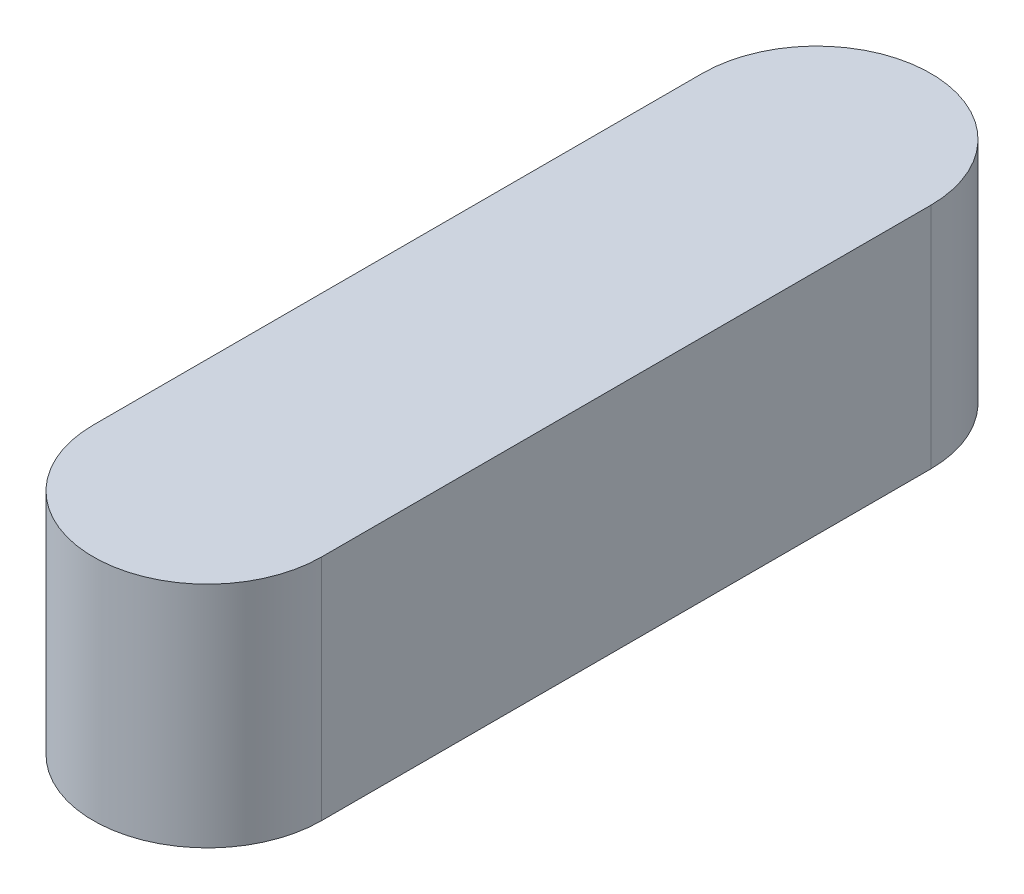
ISO-10303-21;
HEADER;
FILE_DESCRIPTION(('STEP AP214'),'2;1');
FILE_NAME('part.step','',(''),(''),'','','');
FILE_SCHEMA(('AUTOMOTIVE_DESIGN { 1 0 10303 214 1 1 1 1 }'));
ENDSEC;
DATA;
#1=APPLICATION_CONTEXT('core data for automotive mechanical design processes');
#2=APPLICATION_PROTOCOL_DEFINITION('international standard','automotive_design',2000,#1);
#3=PRODUCT_CONTEXT('',#1,'mechanical');
#4=PRODUCT('Part','Part','',(#3));
#5=PRODUCT_RELATED_PRODUCT_CATEGORY('part','',(#4));
#6=PRODUCT_DEFINITION_FORMATION('','',#4);
#7=PRODUCT_DEFINITION_CONTEXT('part definition',#1,'design');
#8=PRODUCT_DEFINITION('design','',#6,#7);
#9=PRODUCT_DEFINITION_SHAPE('','',#8);
#10=(LENGTH_UNIT() NAMED_UNIT(*) SI_UNIT(.MILLI.,.METRE.));
#11=(NAMED_UNIT(*) PLANE_ANGLE_UNIT() SI_UNIT($,.RADIAN.));
#12=(NAMED_UNIT(*) SI_UNIT($,.STERADIAN.) SOLID_ANGLE_UNIT());
#13=UNCERTAINTY_MEASURE_WITH_UNIT(LENGTH_MEASURE(1.E-05),#10,'distance_accuracy_value','');
#14=(GEOMETRIC_REPRESENTATION_CONTEXT(3) GLOBAL_UNCERTAINTY_ASSIGNED_CONTEXT((#13)) GLOBAL_UNIT_ASSIGNED_CONTEXT((#10,
#11,#12)) REPRESENTATION_CONTEXT('',''));
#15=CARTESIAN_POINT('',(0.,0.,0.));
#16=DIRECTION('',(0.,0.,1.));
#17=DIRECTION('',(1.,0.,0.));
#18=AXIS2_PLACEMENT_3D('',#15,#16,#17);
#19=CARTESIAN_POINT('',(3.,-3.,8.));
#20=DIRECTION('',(-1.,0.,0.));
#21=DIRECTION('',(0.,0.,1.));
#22=AXIS2_PLACEMENT_3D('',#19,#20,#21);
#23=PLANE('',#22);
#24=DIRECTION('',(0.,1.,0.));
#25=VECTOR('',#24,1.);
#26=CARTESIAN_POINT('',(3.,-3.,-8.));
#27=LINE('',#26,#25);
#28=CARTESIAN_POINT('',(3.,-3.,-8.));
#29=VERTEX_POINT('',#28);
#30=CARTESIAN_POINT('',(3.,3.,-8.));
#31=VERTEX_POINT('',#30);
#32=EDGE_CURVE('E68',#29,#31,#27,.T.);
#33=ORIENTED_EDGE('',*,*,#32,.T.);
#34=DIRECTION('',(0.,0.,-1.));
#35=VECTOR('',#34,1.);
#36=CARTESIAN_POINT('',(3.,3.,8.));
#37=LINE('',#36,#35);
#38=CARTESIAN_POINT('',(3.,3.,8.));
#39=VERTEX_POINT('',#38);
#40=EDGE_CURVE('E11',#39,#31,#37,.T.);
#41=ORIENTED_EDGE('',*,*,#40,.F.);
#42=DIRECTION('',(0.,1.,0.));
#43=VECTOR('',#42,1.);
#44=CARTESIAN_POINT('',(3.,-3.,8.));
#45=LINE('',#44,#43);
#46=CARTESIAN_POINT('',(3.,-3.,8.));
#47=VERTEX_POINT('',#46);
#48=EDGE_CURVE('E84',#47,#39,#45,.T.);
#49=ORIENTED_EDGE('',*,*,#48,.F.);
#50=DIRECTION('',(0.,0.,-1.));
#51=VECTOR('',#50,1.);
#52=CARTESIAN_POINT('',(3.,-3.,8.));
#53=LINE('',#52,#51);
#54=EDGE_CURVE('E47',#47,#29,#53,.T.);
#55=ORIENTED_EDGE('',*,*,#54,.T.);
#56=EDGE_LOOP('',(#33,#41,#49,#55));
#57=FACE_BOUND('',#56,.T.);
#58=ADVANCED_FACE('F32',(#57),#23,.F.);
#59=CARTESIAN_POINT('',(-3.,3.,8.));
#60=DIRECTION('',(0.,-1.,0.));
#61=DIRECTION('',(0.,0.,-1.));
#62=AXIS2_PLACEMENT_3D('',#59,#60,#61);
#63=PLANE('',#62);
#64=ORIENTED_EDGE('',*,*,#40,.T.);
#65=CARTESIAN_POINT('',(0.,3.,-8.));
#66=DIRECTION('',(0.,-1.,0.));
#67=DIRECTION('',(0.,0.,-1.));
#68=AXIS2_PLACEMENT_3D('',#65,#66,#67);
#69=CIRCLE('',#68,3.);
#70=CARTESIAN_POINT('',(-3.,3.,-8.));
#71=VERTEX_POINT('',#70);
#72=EDGE_CURVE('E74',#31,#71,#69,.F.);
#73=ORIENTED_EDGE('',*,*,#72,.T.);
#74=DIRECTION('',(0.,0.,-1.));
#75=VECTOR('',#74,1.);
#76=CARTESIAN_POINT('',(-3.,3.,8.));
#77=LINE('',#76,#75);
#78=CARTESIAN_POINT('',(-3.,3.,8.));
#79=VERTEX_POINT('',#78);
#80=EDGE_CURVE('E40',#79,#71,#77,.T.);
#81=ORIENTED_EDGE('',*,*,#80,.F.);
#82=CARTESIAN_POINT('',(0.,3.,8.));
#83=DIRECTION('',(0.,-1.,0.));
#84=DIRECTION('',(0.,0.,-1.));
#85=AXIS2_PLACEMENT_3D('',#82,#83,#84);
#86=CIRCLE('',#85,3.);
#87=EDGE_CURVE('E77',#79,#39,#86,.F.);
#88=ORIENTED_EDGE('',*,*,#87,.T.);
#89=EDGE_LOOP('',(#64,#73,#81,#88));
#90=FACE_BOUND('',#89,.T.);
#91=ADVANCED_FACE('F99',(#90),#63,.F.);
#92=CARTESIAN_POINT('',(-3.,-3.,8.));
#93=DIRECTION('',(1.,0.,0.));
#94=DIRECTION('',(0.,0.,-1.));
#95=AXIS2_PLACEMENT_3D('',#92,#93,#94);
#96=PLANE('',#95);
#97=DIRECTION('',(0.,-1.,0.));
#98=VECTOR('',#97,1.);
#99=CARTESIAN_POINT('',(-3.,-3.,-8.));
#100=LINE('',#99,#98);
#101=CARTESIAN_POINT('',(-3.,-3.,-8.));
#102=VERTEX_POINT('',#101);
#103=EDGE_CURVE('E76',#71,#102,#100,.T.);
#104=ORIENTED_EDGE('',*,*,#103,.T.);
#105=DIRECTION('',(0.,0.,-1.));
#106=VECTOR('',#105,1.);
#107=CARTESIAN_POINT('',(-3.,-3.,8.));
#108=LINE('',#107,#106);
#109=CARTESIAN_POINT('',(-3.,-3.,8.));
#110=VERTEX_POINT('',#109);
#111=EDGE_CURVE('E81',#110,#102,#108,.T.);
#112=ORIENTED_EDGE('',*,*,#111,.F.);
#113=DIRECTION('',(0.,-1.,0.));
#114=VECTOR('',#113,1.);
#115=CARTESIAN_POINT('',(-3.,-3.,8.));
#116=LINE('',#115,#114);
#117=EDGE_CURVE('E86',#79,#110,#116,.T.);
#118=ORIENTED_EDGE('',*,*,#117,.F.);
#119=ORIENTED_EDGE('',*,*,#80,.T.);
#120=EDGE_LOOP('',(#104,#112,#118,#119));
#121=FACE_BOUND('',#120,.T.);
#122=ADVANCED_FACE('F95',(#121),#96,.F.);
#123=CARTESIAN_POINT('',(-3.,-3.,8.));
#124=DIRECTION('',(0.,1.,0.));
#125=DIRECTION('',(0.,0.,1.));
#126=AXIS2_PLACEMENT_3D('',#123,#124,#125);
#127=PLANE('',#126);
#128=ORIENTED_EDGE('',*,*,#111,.T.);
#129=CARTESIAN_POINT('',(0.,-3.,-8.));
#130=DIRECTION('',(0.,-1.,0.));
#131=DIRECTION('',(0.,0.,1.));
#132=AXIS2_PLACEMENT_3D('',#129,#130,#131);
#133=CIRCLE('',#132,3.);
#134=EDGE_CURVE('E71',#102,#29,#133,.T.);
#135=ORIENTED_EDGE('',*,*,#134,.T.);
#136=ORIENTED_EDGE('',*,*,#54,.F.);
#137=CARTESIAN_POINT('',(0.,-3.,8.));
#138=DIRECTION('',(0.,-1.,0.));
#139=DIRECTION('',(0.,0.,1.));
#140=AXIS2_PLACEMENT_3D('',#137,#138,#139);
#141=CIRCLE('',#140,3.);
#142=EDGE_CURVE('E102',#47,#110,#141,.T.);
#143=ORIENTED_EDGE('',*,*,#142,.T.);
#144=EDGE_LOOP('',(#128,#135,#136,#143));
#145=FACE_BOUND('',#144,.T.);
#146=ADVANCED_FACE('F80',(#145),#127,.F.);
#147=CARTESIAN_POINT('',(0.,9.70820393249937,8.));
#148=DIRECTION('',(0.,-1.,0.));
#149=DIRECTION('',(0.,0.,-1.));
#150=AXIS2_PLACEMENT_3D('',#147,#148,#149);
#151=CYLINDRICAL_SURFACE('',#150,3.);
#152=ORIENTED_EDGE('',*,*,#87,.F.);
#153=ORIENTED_EDGE('',*,*,#117,.T.);
#154=ORIENTED_EDGE('',*,*,#142,.F.);
#155=ORIENTED_EDGE('',*,*,#48,.T.);
#156=EDGE_LOOP('',(#152,#153,#154,#155));
#157=FACE_BOUND('',#156,.T.);
#158=ADVANCED_FACE('F101',(#157),#151,.T.);
#159=CARTESIAN_POINT('',(0.,9.70820393249937,-8.));
#160=DIRECTION('',(0.,-1.,0.));
#161=DIRECTION('',(0.,0.,-1.));
#162=AXIS2_PLACEMENT_3D('',#159,#160,#161);
#163=CYLINDRICAL_SURFACE('',#162,3.);
#164=ORIENTED_EDGE('',*,*,#72,.F.);
#165=ORIENTED_EDGE('',*,*,#32,.F.);
#166=ORIENTED_EDGE('',*,*,#134,.F.);
#167=ORIENTED_EDGE('',*,*,#103,.F.);
#168=EDGE_LOOP('',(#164,#165,#166,#167));
#169=FACE_BOUND('',#168,.T.);
#170=ADVANCED_FACE('F69',(#169),#163,.T.);
#171=CLOSED_SHELL('',(#58,#91,#122,#146,#158,#170));
#172=MANIFOLD_SOLID_BREP('B2',#171);
#173=ADVANCED_BREP_SHAPE_REPRESENTATION('',(#18,#172),#14);
#174=SHAPE_DEFINITION_REPRESENTATION(#9,#173);
ENDSEC;
END-ISO-10303-21;
